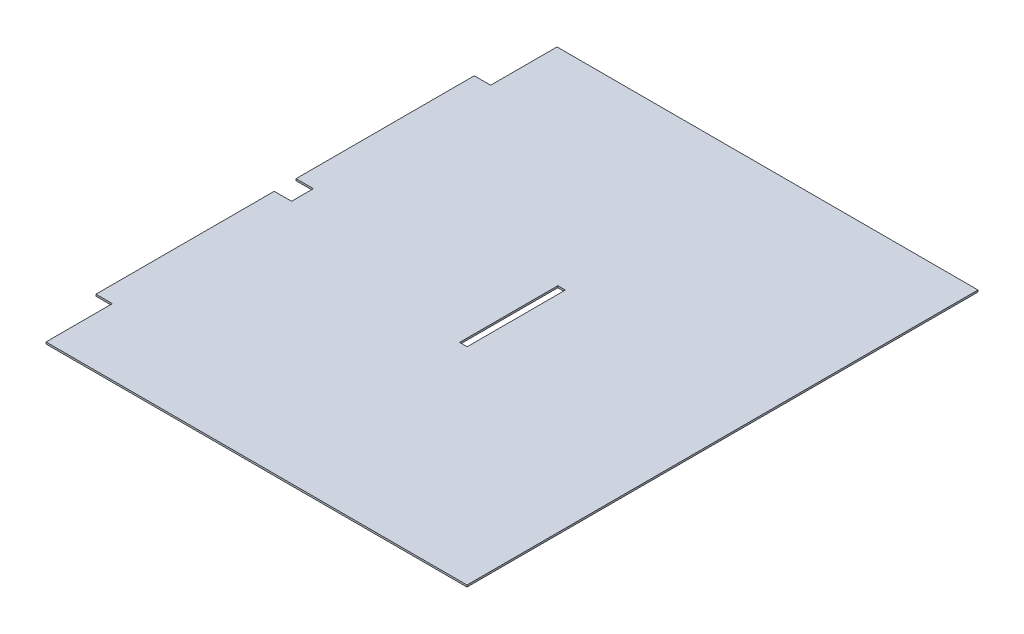
ISO-10303-21;
HEADER;
FILE_DESCRIPTION(('STEP AP214'),'2;1');
FILE_NAME('part.step','',(''),(''),'','','');
FILE_SCHEMA(('AUTOMOTIVE_DESIGN { 1 0 10303 214 1 1 1 1 }'));
ENDSEC;
DATA;
#1=APPLICATION_CONTEXT('core data for automotive mechanical design processes');
#2=APPLICATION_PROTOCOL_DEFINITION('international standard','automotive_design',2000,#1);
#3=PRODUCT_CONTEXT('',#1,'mechanical');
#4=PRODUCT('Part','Part','',(#3));
#5=PRODUCT_RELATED_PRODUCT_CATEGORY('part','',(#4));
#6=PRODUCT_DEFINITION_FORMATION('','',#4);
#7=PRODUCT_DEFINITION_CONTEXT('part definition',#1,'design');
#8=PRODUCT_DEFINITION('design','',#6,#7);
#9=PRODUCT_DEFINITION_SHAPE('','',#8);
#10=(LENGTH_UNIT() NAMED_UNIT(*) SI_UNIT(.MILLI.,.METRE.));
#11=(NAMED_UNIT(*) PLANE_ANGLE_UNIT() SI_UNIT($,.RADIAN.));
#12=(NAMED_UNIT(*) SI_UNIT($,.STERADIAN.) SOLID_ANGLE_UNIT());
#13=UNCERTAINTY_MEASURE_WITH_UNIT(LENGTH_MEASURE(1.E-05),#10,'distance_accuracy_value','');
#14=(GEOMETRIC_REPRESENTATION_CONTEXT(3) GLOBAL_UNCERTAINTY_ASSIGNED_CONTEXT((#13)) GLOBAL_UNIT_ASSIGNED_CONTEXT((#10,
#11,#12)) REPRESENTATION_CONTEXT('',''));
#15=CARTESIAN_POINT('',(0.,0.,0.));
#16=DIRECTION('',(0.,0.,1.));
#17=DIRECTION('',(1.,0.,0.));
#18=AXIS2_PLACEMENT_3D('',#15,#16,#17);
#19=CARTESIAN_POINT('',(0.,61.,0.));
#20=DIRECTION('',(0.,-1.,0.));
#21=DIRECTION('',(0.,0.,-1.));
#22=AXIS2_PLACEMENT_3D('',#19,#20,#21);
#23=PLANE('',#22);
#24=DIRECTION('',(1.,0.,0.));
#25=VECTOR('',#24,1.);
#26=CARTESIAN_POINT('',(-125.,61.,104.));
#27=LINE('',#26,#25);
#28=CARTESIAN_POINT('',(-125.,61.,104.));
#29=VERTEX_POINT('',#28);
#30=CARTESIAN_POINT('',(-116.,61.,104.));
#31=VERTEX_POINT('',#30);
#32=EDGE_CURVE('E188',#29,#31,#27,.T.);
#33=ORIENTED_EDGE('',*,*,#32,.T.);
#34=DIRECTION('',(0.,0.,1.));
#35=VECTOR('',#34,1.);
#36=CARTESIAN_POINT('',(-116.,61.,104.));
#37=LINE('',#36,#35);
#38=CARTESIAN_POINT('',(-116.,61.,140.475));
#39=VERTEX_POINT('',#38);
#40=EDGE_CURVE('E191',#31,#39,#37,.T.);
#41=ORIENTED_EDGE('',*,*,#40,.T.);
#42=DIRECTION('',(1.,0.,0.));
#43=VECTOR('',#42,1.);
#44=CARTESIAN_POINT('',(-116.,61.,140.475));
#45=LINE('',#44,#43);
#46=CARTESIAN_POINT('',(115.475,61.,140.475));
#47=VERTEX_POINT('',#46);
#48=EDGE_CURVE('E194',#39,#47,#45,.T.);
#49=ORIENTED_EDGE('',*,*,#48,.T.);
#50=DIRECTION('',(0.,0.,-1.));
#51=VECTOR('',#50,1.);
#52=CARTESIAN_POINT('',(115.475,61.,-140.475));
#53=LINE('',#52,#51);
#54=CARTESIAN_POINT('',(115.475,61.,-140.475));
#55=VERTEX_POINT('',#54);
#56=EDGE_CURVE('E196',#47,#55,#53,.T.);
#57=ORIENTED_EDGE('',*,*,#56,.T.);
#58=DIRECTION('',(-1.,0.,0.));
#59=VECTOR('',#58,1.);
#60=CARTESIAN_POINT('',(-116.,61.,-140.475));
#61=LINE('',#60,#59);
#62=CARTESIAN_POINT('',(-116.,61.,-140.475));
#63=VERTEX_POINT('',#62);
#64=EDGE_CURVE('E198',#55,#63,#61,.T.);
#65=ORIENTED_EDGE('',*,*,#64,.T.);
#66=DIRECTION('',(0.,0.,1.));
#67=VECTOR('',#66,1.);
#68=CARTESIAN_POINT('',(-116.,61.,-104.));
#69=LINE('',#68,#67);
#70=CARTESIAN_POINT('',(-116.,61.,-104.));
#71=VERTEX_POINT('',#70);
#72=EDGE_CURVE('E200',#63,#71,#69,.T.);
#73=ORIENTED_EDGE('',*,*,#72,.T.);
#74=DIRECTION('',(-1.,0.,0.));
#75=VECTOR('',#74,1.);
#76=CARTESIAN_POINT('',(-125.,61.,-104.));
#77=LINE('',#76,#75);
#78=CARTESIAN_POINT('',(-125.,61.,-104.));
#79=VERTEX_POINT('',#78);
#80=EDGE_CURVE('E202',#71,#79,#77,.T.);
#81=ORIENTED_EDGE('',*,*,#80,.T.);
#82=DIRECTION('',(0.,0.,1.));
#83=VECTOR('',#82,1.);
#84=CARTESIAN_POINT('',(-125.,61.,-104.));
#85=LINE('',#84,#83);
#86=CARTESIAN_POINT('',(-125.,61.,-5.99999999999994));
#87=VERTEX_POINT('',#86);
#88=EDGE_CURVE('E204',#79,#87,#85,.T.);
#89=ORIENTED_EDGE('',*,*,#88,.T.);
#90=DIRECTION('',(1.,0.,0.));
#91=VECTOR('',#90,1.);
#92=CARTESIAN_POINT('',(-125.,61.,-5.99999999999994));
#93=LINE('',#92,#91);
#94=CARTESIAN_POINT('',(-115.475,61.,-5.99999999999994));
#95=VERTEX_POINT('',#94);
#96=EDGE_CURVE('E206',#87,#95,#93,.T.);
#97=ORIENTED_EDGE('',*,*,#96,.T.);
#98=DIRECTION('',(0.,0.,1.));
#99=VECTOR('',#98,1.);
#100=CARTESIAN_POINT('',(-115.475,61.,-5.99999999999994));
#101=LINE('',#100,#99);
#102=CARTESIAN_POINT('',(-115.475,61.,6.00000000000006));
#103=VERTEX_POINT('',#102);
#104=EDGE_CURVE('E208',#95,#103,#101,.T.);
#105=ORIENTED_EDGE('',*,*,#104,.T.);
#106=DIRECTION('',(-1.,0.,0.));
#107=VECTOR('',#106,1.);
#108=CARTESIAN_POINT('',(-125.,61.,6.00000000000006));
#109=LINE('',#108,#107);
#110=CARTESIAN_POINT('',(-125.,61.,6.00000000000006));
#111=VERTEX_POINT('',#110);
#112=EDGE_CURVE('E210',#103,#111,#109,.T.);
#113=ORIENTED_EDGE('',*,*,#112,.T.);
#114=DIRECTION('',(0.,0.,1.));
#115=VECTOR('',#114,1.);
#116=CARTESIAN_POINT('',(-125.,61.,6.00000000000006));
#117=LINE('',#116,#115);
#118=EDGE_CURVE('E212',#111,#29,#117,.T.);
#119=ORIENTED_EDGE('',*,*,#118,.T.);
#120=EDGE_LOOP('',(#33,#41,#49,#57,#65,#73,#81,#89,#97,#105,#113,#119));
#121=FACE_BOUND('',#120,.T.);
#122=DIRECTION('',(0.,0.,-1.));
#123=VECTOR('',#122,1.);
#124=CARTESIAN_POINT('',(2.075,61.,-27.));
#125=LINE('',#124,#123);
#126=CARTESIAN_POINT('',(2.075,61.,27.));
#127=VERTEX_POINT('',#126);
#128=CARTESIAN_POINT('',(2.075,61.,-27.));
#129=VERTEX_POINT('',#128);
#130=EDGE_CURVE('E152',#127,#129,#125,.T.);
#131=ORIENTED_EDGE('',*,*,#130,.F.);
#132=DIRECTION('',(1.,0.,0.));
#133=VECTOR('',#132,1.);
#134=CARTESIAN_POINT('',(-2.075,61.,27.));
#135=LINE('',#134,#133);
#136=CARTESIAN_POINT('',(-2.075,61.,27.));
#137=VERTEX_POINT('',#136);
#138=EDGE_CURVE('E174',#137,#127,#135,.T.);
#139=ORIENTED_EDGE('',*,*,#138,.F.);
#140=DIRECTION('',(0.,0.,1.));
#141=VECTOR('',#140,1.);
#142=CARTESIAN_POINT('',(-2.075,61.,-27.));
#143=LINE('',#142,#141);
#144=CARTESIAN_POINT('',(-2.075,61.,-27.));
#145=VERTEX_POINT('',#144);
#146=EDGE_CURVE('E172',#145,#137,#143,.T.);
#147=ORIENTED_EDGE('',*,*,#146,.F.);
#148=DIRECTION('',(-1.,0.,0.));
#149=VECTOR('',#148,1.);
#150=CARTESIAN_POINT('',(-2.075,61.,-27.));
#151=LINE('',#150,#149);
#152=EDGE_CURVE('E160',#129,#145,#151,.T.);
#153=ORIENTED_EDGE('',*,*,#152,.F.);
#154=EDGE_LOOP('',(#131,#139,#147,#153));
#155=FACE_BOUND('',#154,.T.);
#156=ADVANCED_FACE('F39',(#121,#155),#23,.F.);
#157=CARTESIAN_POINT('',(0.,60.,0.));
#158=DIRECTION('',(0.,-1.,0.));
#159=DIRECTION('',(0.,0.,-1.));
#160=AXIS2_PLACEMENT_3D('',#157,#158,#159);
#161=PLANE('',#160);
#162=DIRECTION('',(1.,0.,0.));
#163=VECTOR('',#162,1.);
#164=CARTESIAN_POINT('',(-125.,60.,104.));
#165=LINE('',#164,#163);
#166=CARTESIAN_POINT('',(-125.,60.,104.));
#167=VERTEX_POINT('',#166);
#168=CARTESIAN_POINT('',(-116.,60.,104.));
#169=VERTEX_POINT('',#168);
#170=EDGE_CURVE('E168',#167,#169,#165,.T.);
#171=ORIENTED_EDGE('',*,*,#170,.F.);
#172=DIRECTION('',(0.,0.,1.));
#173=VECTOR('',#172,1.);
#174=CARTESIAN_POINT('',(-125.,60.,6.00000000000006));
#175=LINE('',#174,#173);
#176=CARTESIAN_POINT('',(-125.,60.,6.00000000000006));
#177=VERTEX_POINT('',#176);
#178=EDGE_CURVE('E192',#177,#167,#175,.T.);
#179=ORIENTED_EDGE('',*,*,#178,.F.);
#180=DIRECTION('',(-1.,0.,0.));
#181=VECTOR('',#180,1.);
#182=CARTESIAN_POINT('',(-125.,60.,6.00000000000006));
#183=LINE('',#182,#181);
#184=CARTESIAN_POINT('',(-115.475,60.,6.00000000000006));
#185=VERTEX_POINT('',#184);
#186=EDGE_CURVE('E235',#185,#177,#183,.T.);
#187=ORIENTED_EDGE('',*,*,#186,.F.);
#188=DIRECTION('',(0.,0.,1.));
#189=VECTOR('',#188,1.);
#190=CARTESIAN_POINT('',(-115.475,60.,-5.99999999999994));
#191=LINE('',#190,#189);
#192=CARTESIAN_POINT('',(-115.475,60.,-5.99999999999994));
#193=VERTEX_POINT('',#192);
#194=EDGE_CURVE('E233',#193,#185,#191,.T.);
#195=ORIENTED_EDGE('',*,*,#194,.F.);
#196=DIRECTION('',(1.,0.,0.));
#197=VECTOR('',#196,1.);
#198=CARTESIAN_POINT('',(-125.,60.,-5.99999999999994));
#199=LINE('',#198,#197);
#200=CARTESIAN_POINT('',(-125.,60.,-5.99999999999994));
#201=VERTEX_POINT('',#200);
#202=EDGE_CURVE('E231',#201,#193,#199,.T.);
#203=ORIENTED_EDGE('',*,*,#202,.F.);
#204=DIRECTION('',(0.,0.,1.));
#205=VECTOR('',#204,1.);
#206=CARTESIAN_POINT('',(-125.,60.,-104.));
#207=LINE('',#206,#205);
#208=CARTESIAN_POINT('',(-125.,60.,-104.));
#209=VERTEX_POINT('',#208);
#210=EDGE_CURVE('E229',#209,#201,#207,.T.);
#211=ORIENTED_EDGE('',*,*,#210,.F.);
#212=DIRECTION('',(-1.,0.,0.));
#213=VECTOR('',#212,1.);
#214=CARTESIAN_POINT('',(-125.,60.,-104.));
#215=LINE('',#214,#213);
#216=CARTESIAN_POINT('',(-116.,60.,-104.));
#217=VERTEX_POINT('',#216);
#218=EDGE_CURVE('E227',#217,#209,#215,.T.);
#219=ORIENTED_EDGE('',*,*,#218,.F.);
#220=DIRECTION('',(0.,0.,1.));
#221=VECTOR('',#220,1.);
#222=CARTESIAN_POINT('',(-116.,60.,-104.));
#223=LINE('',#222,#221);
#224=CARTESIAN_POINT('',(-116.,60.,-140.475));
#225=VERTEX_POINT('',#224);
#226=EDGE_CURVE('E225',#225,#217,#223,.T.);
#227=ORIENTED_EDGE('',*,*,#226,.F.);
#228=DIRECTION('',(-1.,0.,0.));
#229=VECTOR('',#228,1.);
#230=CARTESIAN_POINT('',(-116.,60.,-140.475));
#231=LINE('',#230,#229);
#232=CARTESIAN_POINT('',(115.475,60.,-140.475));
#233=VERTEX_POINT('',#232);
#234=EDGE_CURVE('E223',#233,#225,#231,.T.);
#235=ORIENTED_EDGE('',*,*,#234,.F.);
#236=DIRECTION('',(0.,0.,-1.));
#237=VECTOR('',#236,1.);
#238=CARTESIAN_POINT('',(115.475,60.,-140.475));
#239=LINE('',#238,#237);
#240=CARTESIAN_POINT('',(115.475,60.,140.475));
#241=VERTEX_POINT('',#240);
#242=EDGE_CURVE('E221',#241,#233,#239,.T.);
#243=ORIENTED_EDGE('',*,*,#242,.F.);
#244=DIRECTION('',(1.,0.,0.));
#245=VECTOR('',#244,1.);
#246=CARTESIAN_POINT('',(-116.,60.,140.475));
#247=LINE('',#246,#245);
#248=CARTESIAN_POINT('',(-116.,60.,140.475));
#249=VERTEX_POINT('',#248);
#250=EDGE_CURVE('E219',#249,#241,#247,.T.);
#251=ORIENTED_EDGE('',*,*,#250,.F.);
#252=DIRECTION('',(0.,0.,1.));
#253=VECTOR('',#252,1.);
#254=CARTESIAN_POINT('',(-116.,60.,104.));
#255=LINE('',#254,#253);
#256=EDGE_CURVE('E217',#169,#249,#255,.T.);
#257=ORIENTED_EDGE('',*,*,#256,.F.);
#258=EDGE_LOOP('',(#171,#179,#187,#195,#203,#211,#219,#227,#235,#243,#251,#257));
#259=FACE_BOUND('',#258,.T.);
#260=DIRECTION('',(1.,0.,0.));
#261=VECTOR('',#260,1.);
#262=CARTESIAN_POINT('',(-2.075,60.,27.));
#263=LINE('',#262,#261);
#264=CARTESIAN_POINT('',(-2.075,60.,27.));
#265=VERTEX_POINT('',#264);
#266=CARTESIAN_POINT('',(2.075,60.,27.));
#267=VERTEX_POINT('',#266);
#268=EDGE_CURVE('E161',#265,#267,#263,.T.);
#269=ORIENTED_EDGE('',*,*,#268,.T.);
#270=DIRECTION('',(0.,0.,-1.));
#271=VECTOR('',#270,1.);
#272=CARTESIAN_POINT('',(2.075,60.,-27.));
#273=LINE('',#272,#271);
#274=CARTESIAN_POINT('',(2.075,60.,-27.));
#275=VERTEX_POINT('',#274);
#276=EDGE_CURVE('E62',#267,#275,#273,.T.);
#277=ORIENTED_EDGE('',*,*,#276,.T.);
#278=DIRECTION('',(-1.,0.,0.));
#279=VECTOR('',#278,1.);
#280=CARTESIAN_POINT('',(-2.075,60.,-27.));
#281=LINE('',#280,#279);
#282=CARTESIAN_POINT('',(-2.075,60.,-27.));
#283=VERTEX_POINT('',#282);
#284=EDGE_CURVE('E167',#275,#283,#281,.T.);
#285=ORIENTED_EDGE('',*,*,#284,.T.);
#286=DIRECTION('',(0.,0.,1.));
#287=VECTOR('',#286,1.);
#288=CARTESIAN_POINT('',(-2.075,60.,-27.));
#289=LINE('',#288,#287);
#290=EDGE_CURVE('E180',#283,#265,#289,.T.);
#291=ORIENTED_EDGE('',*,*,#290,.T.);
#292=EDGE_LOOP('',(#269,#277,#285,#291));
#293=FACE_BOUND('',#292,.T.);
#294=ADVANCED_FACE('F277',(#259,#293),#161,.T.);
#295=CARTESIAN_POINT('',(-125.,61.,104.));
#296=DIRECTION('',(0.,0.,-1.));
#297=DIRECTION('',(-1.,0.,0.));
#298=AXIS2_PLACEMENT_3D('',#295,#296,#297);
#299=PLANE('',#298);
#300=ORIENTED_EDGE('',*,*,#170,.T.);
#301=DIRECTION('',(0.,-1.,0.));
#302=VECTOR('',#301,1.);
#303=CARTESIAN_POINT('',(-116.,61.,104.));
#304=LINE('',#303,#302);
#305=EDGE_CURVE('E11',#31,#169,#304,.T.);
#306=ORIENTED_EDGE('',*,*,#305,.F.);
#307=ORIENTED_EDGE('',*,*,#32,.F.);
#308=DIRECTION('',(0.,-1.,0.));
#309=VECTOR('',#308,1.);
#310=CARTESIAN_POINT('',(-125.,61.,104.));
#311=LINE('',#310,#309);
#312=EDGE_CURVE('E214',#29,#167,#311,.T.);
#313=ORIENTED_EDGE('',*,*,#312,.T.);
#314=EDGE_LOOP('',(#300,#306,#307,#313));
#315=FACE_BOUND('',#314,.T.);
#316=ADVANCED_FACE('F41',(#315),#299,.F.);
#317=CARTESIAN_POINT('',(-116.,61.,104.));
#318=DIRECTION('',(1.,0.,0.));
#319=DIRECTION('',(0.,0.,-1.));
#320=AXIS2_PLACEMENT_3D('',#317,#318,#319);
#321=PLANE('',#320);
#322=ORIENTED_EDGE('',*,*,#256,.T.);
#323=DIRECTION('',(0.,-1.,0.));
#324=VECTOR('',#323,1.);
#325=CARTESIAN_POINT('',(-116.,61.,140.475));
#326=LINE('',#325,#324);
#327=EDGE_CURVE('E47',#39,#249,#326,.T.);
#328=ORIENTED_EDGE('',*,*,#327,.F.);
#329=ORIENTED_EDGE('',*,*,#40,.F.);
#330=ORIENTED_EDGE('',*,*,#305,.T.);
#331=EDGE_LOOP('',(#322,#328,#329,#330));
#332=FACE_BOUND('',#331,.T.);
#333=ADVANCED_FACE('F294',(#332),#321,.F.);
#334=CARTESIAN_POINT('',(-116.,61.,140.475));
#335=DIRECTION('',(0.,0.,-1.));
#336=DIRECTION('',(-1.,0.,0.));
#337=AXIS2_PLACEMENT_3D('',#334,#335,#336);
#338=PLANE('',#337);
#339=ORIENTED_EDGE('',*,*,#250,.T.);
#340=DIRECTION('',(0.,-1.,0.));
#341=VECTOR('',#340,1.);
#342=CARTESIAN_POINT('',(115.475,61.,140.475));
#343=LINE('',#342,#341);
#344=EDGE_CURVE('E264',#47,#241,#343,.T.);
#345=ORIENTED_EDGE('',*,*,#344,.F.);
#346=ORIENTED_EDGE('',*,*,#48,.F.);
#347=ORIENTED_EDGE('',*,*,#327,.T.);
#348=EDGE_LOOP('',(#339,#345,#346,#347));
#349=FACE_BOUND('',#348,.T.);
#350=ADVANCED_FACE('F271',(#349),#338,.F.);
#351=CARTESIAN_POINT('',(115.475,61.,-140.475));
#352=DIRECTION('',(-1.,0.,0.));
#353=DIRECTION('',(0.,0.,1.));
#354=AXIS2_PLACEMENT_3D('',#351,#352,#353);
#355=PLANE('',#354);
#356=ORIENTED_EDGE('',*,*,#242,.T.);
#357=DIRECTION('',(0.,-1.,0.));
#358=VECTOR('',#357,1.);
#359=CARTESIAN_POINT('',(115.475,61.,-140.475));
#360=LINE('',#359,#358);
#361=EDGE_CURVE('E261',#55,#233,#360,.T.);
#362=ORIENTED_EDGE('',*,*,#361,.F.);
#363=ORIENTED_EDGE('',*,*,#56,.F.);
#364=ORIENTED_EDGE('',*,*,#344,.T.);
#365=EDGE_LOOP('',(#356,#362,#363,#364));
#366=FACE_BOUND('',#365,.T.);
#367=ADVANCED_FACE('F283',(#366),#355,.F.);
#368=CARTESIAN_POINT('',(-116.,61.,-140.475));
#369=DIRECTION('',(0.,0.,1.));
#370=DIRECTION('',(1.,0.,0.));
#371=AXIS2_PLACEMENT_3D('',#368,#369,#370);
#372=PLANE('',#371);
#373=ORIENTED_EDGE('',*,*,#234,.T.);
#374=DIRECTION('',(0.,-1.,0.));
#375=VECTOR('',#374,1.);
#376=CARTESIAN_POINT('',(-116.,61.,-140.475));
#377=LINE('',#376,#375);
#378=EDGE_CURVE('E258',#63,#225,#377,.T.);
#379=ORIENTED_EDGE('',*,*,#378,.F.);
#380=ORIENTED_EDGE('',*,*,#64,.F.);
#381=ORIENTED_EDGE('',*,*,#361,.T.);
#382=EDGE_LOOP('',(#373,#379,#380,#381));
#383=FACE_BOUND('',#382,.T.);
#384=ADVANCED_FACE('F287',(#383),#372,.F.);
#385=CARTESIAN_POINT('',(-116.,61.,-104.));
#386=DIRECTION('',(1.,0.,0.));
#387=DIRECTION('',(0.,0.,-1.));
#388=AXIS2_PLACEMENT_3D('',#385,#386,#387);
#389=PLANE('',#388);
#390=ORIENTED_EDGE('',*,*,#226,.T.);
#391=DIRECTION('',(0.,-1.,0.));
#392=VECTOR('',#391,1.);
#393=CARTESIAN_POINT('',(-116.,61.,-104.));
#394=LINE('',#393,#392);
#395=EDGE_CURVE('E255',#71,#217,#394,.T.);
#396=ORIENTED_EDGE('',*,*,#395,.F.);
#397=ORIENTED_EDGE('',*,*,#72,.F.);
#398=ORIENTED_EDGE('',*,*,#378,.T.);
#399=EDGE_LOOP('',(#390,#396,#397,#398));
#400=FACE_BOUND('',#399,.T.);
#401=ADVANCED_FACE('F327',(#400),#389,.F.);
#402=CARTESIAN_POINT('',(-125.,61.,-104.));
#403=DIRECTION('',(0.,0.,1.));
#404=DIRECTION('',(1.,0.,0.));
#405=AXIS2_PLACEMENT_3D('',#402,#403,#404);
#406=PLANE('',#405);
#407=ORIENTED_EDGE('',*,*,#218,.T.);
#408=DIRECTION('',(0.,-1.,0.));
#409=VECTOR('',#408,1.);
#410=CARTESIAN_POINT('',(-125.,61.,-104.));
#411=LINE('',#410,#409);
#412=EDGE_CURVE('E252',#79,#209,#411,.T.);
#413=ORIENTED_EDGE('',*,*,#412,.F.);
#414=ORIENTED_EDGE('',*,*,#80,.F.);
#415=ORIENTED_EDGE('',*,*,#395,.T.);
#416=EDGE_LOOP('',(#407,#413,#414,#415));
#417=FACE_BOUND('',#416,.T.);
#418=ADVANCED_FACE('F325',(#417),#406,.F.);
#419=CARTESIAN_POINT('',(-125.,61.,-104.));
#420=DIRECTION('',(1.,0.,0.));
#421=DIRECTION('',(0.,0.,-1.));
#422=AXIS2_PLACEMENT_3D('',#419,#420,#421);
#423=PLANE('',#422);
#424=ORIENTED_EDGE('',*,*,#210,.T.);
#425=DIRECTION('',(0.,-1.,0.));
#426=VECTOR('',#425,1.);
#427=CARTESIAN_POINT('',(-125.,61.,-5.99999999999994));
#428=LINE('',#427,#426);
#429=EDGE_CURVE('E249',#87,#201,#428,.T.);
#430=ORIENTED_EDGE('',*,*,#429,.F.);
#431=ORIENTED_EDGE('',*,*,#88,.F.);
#432=ORIENTED_EDGE('',*,*,#412,.T.);
#433=EDGE_LOOP('',(#424,#430,#431,#432));
#434=FACE_BOUND('',#433,.T.);
#435=ADVANCED_FACE('F321',(#434),#423,.F.);
#436=CARTESIAN_POINT('',(-125.,61.,-5.99999999999994));
#437=DIRECTION('',(0.,0.,-1.));
#438=DIRECTION('',(-1.,0.,0.));
#439=AXIS2_PLACEMENT_3D('',#436,#437,#438);
#440=PLANE('',#439);
#441=ORIENTED_EDGE('',*,*,#202,.T.);
#442=DIRECTION('',(0.,-1.,0.));
#443=VECTOR('',#442,1.);
#444=CARTESIAN_POINT('',(-115.475,61.,-5.99999999999994));
#445=LINE('',#444,#443);
#446=EDGE_CURVE('E246',#95,#193,#445,.T.);
#447=ORIENTED_EDGE('',*,*,#446,.F.);
#448=ORIENTED_EDGE('',*,*,#96,.F.);
#449=ORIENTED_EDGE('',*,*,#429,.T.);
#450=EDGE_LOOP('',(#441,#447,#448,#449));
#451=FACE_BOUND('',#450,.T.);
#452=ADVANCED_FACE('F316',(#451),#440,.F.);
#453=CARTESIAN_POINT('',(-115.475,61.,-5.99999999999994));
#454=DIRECTION('',(1.,0.,0.));
#455=DIRECTION('',(0.,0.,-1.));
#456=AXIS2_PLACEMENT_3D('',#453,#454,#455);
#457=PLANE('',#456);
#458=ORIENTED_EDGE('',*,*,#194,.T.);
#459=DIRECTION('',(0.,-1.,0.));
#460=VECTOR('',#459,1.);
#461=CARTESIAN_POINT('',(-115.475,61.,6.00000000000006));
#462=LINE('',#461,#460);
#463=EDGE_CURVE('E243',#103,#185,#462,.T.);
#464=ORIENTED_EDGE('',*,*,#463,.F.);
#465=ORIENTED_EDGE('',*,*,#104,.F.);
#466=ORIENTED_EDGE('',*,*,#446,.T.);
#467=EDGE_LOOP('',(#458,#464,#465,#466));
#468=FACE_BOUND('',#467,.T.);
#469=ADVANCED_FACE('F310',(#468),#457,.F.);
#470=CARTESIAN_POINT('',(-125.,61.,6.00000000000006));
#471=DIRECTION('',(0.,0.,1.));
#472=DIRECTION('',(1.,0.,0.));
#473=AXIS2_PLACEMENT_3D('',#470,#471,#472);
#474=PLANE('',#473);
#475=ORIENTED_EDGE('',*,*,#186,.T.);
#476=DIRECTION('',(0.,-1.,0.));
#477=VECTOR('',#476,1.);
#478=CARTESIAN_POINT('',(-125.,61.,6.00000000000006));
#479=LINE('',#478,#477);
#480=EDGE_CURVE('E240',#111,#177,#479,.T.);
#481=ORIENTED_EDGE('',*,*,#480,.F.);
#482=ORIENTED_EDGE('',*,*,#112,.F.);
#483=ORIENTED_EDGE('',*,*,#463,.T.);
#484=EDGE_LOOP('',(#475,#481,#482,#483));
#485=FACE_BOUND('',#484,.T.);
#486=ADVANCED_FACE('F306',(#485),#474,.F.);
#487=CARTESIAN_POINT('',(-125.,61.,6.00000000000006));
#488=DIRECTION('',(1.,0.,0.));
#489=DIRECTION('',(0.,0.,-1.));
#490=AXIS2_PLACEMENT_3D('',#487,#488,#489);
#491=PLANE('',#490);
#492=ORIENTED_EDGE('',*,*,#178,.T.);
#493=ORIENTED_EDGE('',*,*,#312,.F.);
#494=ORIENTED_EDGE('',*,*,#118,.F.);
#495=ORIENTED_EDGE('',*,*,#480,.T.);
#496=EDGE_LOOP('',(#492,#493,#494,#495));
#497=FACE_BOUND('',#496,.T.);
#498=ADVANCED_FACE('F301',(#497),#491,.F.);
#499=CARTESIAN_POINT('',(2.075,61.,-27.));
#500=DIRECTION('',(-1.,0.,0.));
#501=DIRECTION('',(0.,0.,1.));
#502=AXIS2_PLACEMENT_3D('',#499,#500,#501);
#503=PLANE('',#502);
#504=ORIENTED_EDGE('',*,*,#276,.F.);
#505=DIRECTION('',(0.,-1.,0.));
#506=VECTOR('',#505,1.);
#507=CARTESIAN_POINT('',(2.075,61.,27.));
#508=LINE('',#507,#506);
#509=EDGE_CURVE('E156',#127,#267,#508,.T.);
#510=ORIENTED_EDGE('',*,*,#509,.F.);
#511=ORIENTED_EDGE('',*,*,#130,.T.);
#512=DIRECTION('',(0.,-1.,0.));
#513=VECTOR('',#512,1.);
#514=CARTESIAN_POINT('',(2.075,61.,-27.));
#515=LINE('',#514,#513);
#516=EDGE_CURVE('E155',#129,#275,#515,.T.);
#517=ORIENTED_EDGE('',*,*,#516,.T.);
#518=EDGE_LOOP('',(#504,#510,#511,#517));
#519=FACE_BOUND('',#518,.T.);
#520=ADVANCED_FACE('F154',(#519),#503,.T.);
#521=CARTESIAN_POINT('',(-2.075,61.,-27.));
#522=DIRECTION('',(0.,0.,1.));
#523=DIRECTION('',(1.,0.,0.));
#524=AXIS2_PLACEMENT_3D('',#521,#522,#523);
#525=PLANE('',#524);
#526=ORIENTED_EDGE('',*,*,#284,.F.);
#527=ORIENTED_EDGE('',*,*,#516,.F.);
#528=ORIENTED_EDGE('',*,*,#152,.T.);
#529=DIRECTION('',(0.,-1.,0.));
#530=VECTOR('',#529,1.);
#531=CARTESIAN_POINT('',(-2.075,61.,-27.));
#532=LINE('',#531,#530);
#533=EDGE_CURVE('E169',#145,#283,#532,.T.);
#534=ORIENTED_EDGE('',*,*,#533,.T.);
#535=EDGE_LOOP('',(#526,#527,#528,#534));
#536=FACE_BOUND('',#535,.T.);
#537=ADVANCED_FACE('F164',(#536),#525,.T.);
#538=CARTESIAN_POINT('',(-2.075,61.,-27.));
#539=DIRECTION('',(1.,0.,0.));
#540=DIRECTION('',(0.,0.,-1.));
#541=AXIS2_PLACEMENT_3D('',#538,#539,#540);
#542=PLANE('',#541);
#543=ORIENTED_EDGE('',*,*,#290,.F.);
#544=ORIENTED_EDGE('',*,*,#533,.F.);
#545=ORIENTED_EDGE('',*,*,#146,.T.);
#546=DIRECTION('',(0.,-1.,0.));
#547=VECTOR('',#546,1.);
#548=CARTESIAN_POINT('',(-2.075,61.,27.));
#549=LINE('',#548,#547);
#550=EDGE_CURVE('E54',#137,#265,#549,.T.);
#551=ORIENTED_EDGE('',*,*,#550,.T.);
#552=EDGE_LOOP('',(#543,#544,#545,#551));
#553=FACE_BOUND('',#552,.T.);
#554=ADVANCED_FACE('F391',(#553),#542,.T.);
#555=CARTESIAN_POINT('',(-2.075,61.,27.));
#556=DIRECTION('',(0.,0.,-1.));
#557=DIRECTION('',(-1.,0.,0.));
#558=AXIS2_PLACEMENT_3D('',#555,#556,#557);
#559=PLANE('',#558);
#560=ORIENTED_EDGE('',*,*,#268,.F.);
#561=ORIENTED_EDGE('',*,*,#550,.F.);
#562=ORIENTED_EDGE('',*,*,#138,.T.);
#563=ORIENTED_EDGE('',*,*,#509,.T.);
#564=EDGE_LOOP('',(#560,#561,#562,#563));
#565=FACE_BOUND('',#564,.T.);
#566=ADVANCED_FACE('F398',(#565),#559,.T.);
#567=CLOSED_SHELL('',(#156,#294,#316,#333,#350,#367,#384,#401,#418,#435,#452,#469,#486,#498,
#520,#537,#554,#566));
#568=MANIFOLD_SOLID_BREP('B2',#567);
#569=ADVANCED_BREP_SHAPE_REPRESENTATION('',(#18,#568),#14);
#570=SHAPE_DEFINITION_REPRESENTATION(#9,#569);
ENDSEC;
END-ISO-10303-21;
